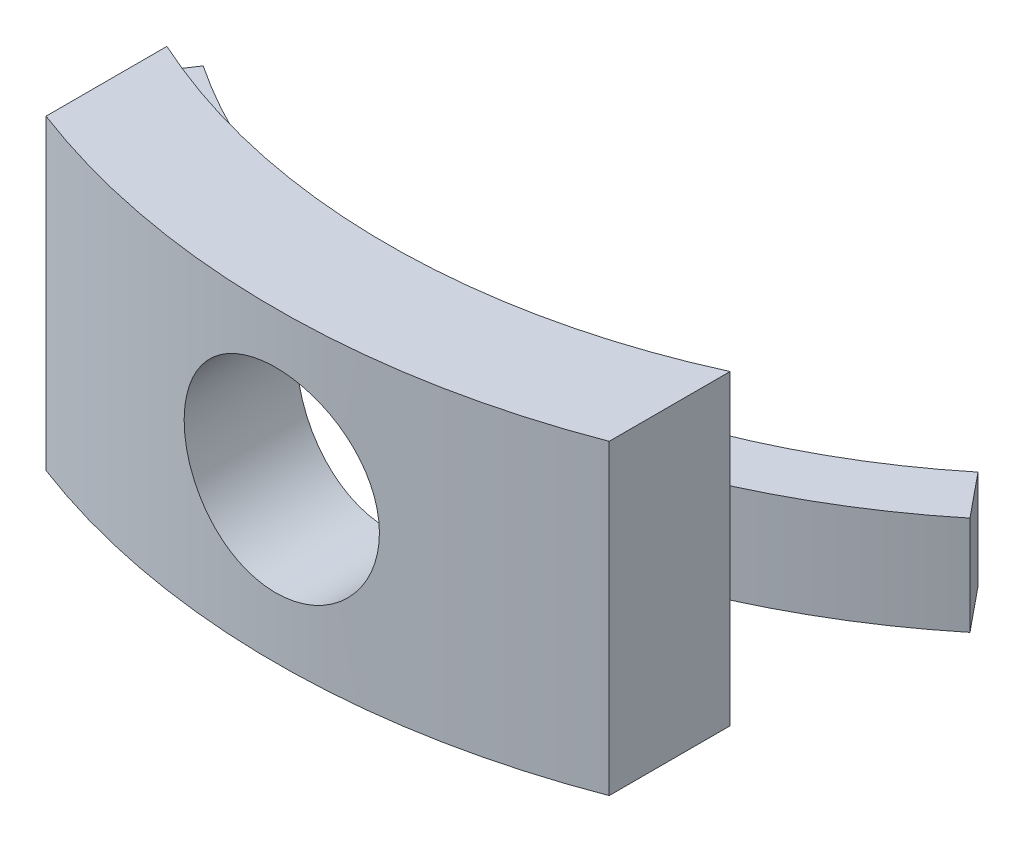
ISO-10303-21;
HEADER;
FILE_DESCRIPTION(('STEP AP214'),'2;1');
FILE_NAME('part.step','',(''),(''),'','','');
FILE_SCHEMA(('AUTOMOTIVE_DESIGN { 1 0 10303 214 1 1 1 1 }'));
ENDSEC;
DATA;
#1=APPLICATION_CONTEXT('core data for automotive mechanical design processes');
#2=APPLICATION_PROTOCOL_DEFINITION('international standard','automotive_design',2000,#1);
#3=PRODUCT_CONTEXT('',#1,'mechanical');
#4=PRODUCT('Part','Part','',(#3));
#5=PRODUCT_RELATED_PRODUCT_CATEGORY('part','',(#4));
#6=PRODUCT_DEFINITION_FORMATION('','',#4);
#7=PRODUCT_DEFINITION_CONTEXT('part definition',#1,'design');
#8=PRODUCT_DEFINITION('design','',#6,#7);
#9=PRODUCT_DEFINITION_SHAPE('','',#8);
#10=(LENGTH_UNIT() NAMED_UNIT(*) SI_UNIT(.MILLI.,.METRE.));
#11=(NAMED_UNIT(*) PLANE_ANGLE_UNIT() SI_UNIT($,.RADIAN.));
#12=(NAMED_UNIT(*) SI_UNIT($,.STERADIAN.) SOLID_ANGLE_UNIT());
#13=UNCERTAINTY_MEASURE_WITH_UNIT(LENGTH_MEASURE(1.E-05),#10,'distance_accuracy_value','');
#14=(GEOMETRIC_REPRESENTATION_CONTEXT(3) GLOBAL_UNCERTAINTY_ASSIGNED_CONTEXT((#13)) GLOBAL_UNIT_ASSIGNED_CONTEXT((#10,
#11,#12)) REPRESENTATION_CONTEXT('',''));
#15=CARTESIAN_POINT('',(0.,0.,0.));
#16=DIRECTION('',(0.,0.,1.));
#17=DIRECTION('',(1.,0.,0.));
#18=AXIS2_PLACEMENT_3D('',#15,#16,#17);
#19=CARTESIAN_POINT('',(0.,31.,0.));
#20=DIRECTION('',(0.,-1.,0.));
#21=DIRECTION('',(0.,0.,-1.));
#22=AXIS2_PLACEMENT_3D('',#19,#20,#21);
#23=CYLINDRICAL_SURFACE('',#22,79.871147441617);
#24=DIRECTION('',(0.,-1.,0.));
#25=VECTOR('',#24,1.);
#26=CARTESIAN_POINT('',(28.4483592669794,31.,74.6330426061901));
#27=LINE('',#26,#25);
#28=CARTESIAN_POINT('',(28.4483592669794,31.,74.6330426061901));
#29=VERTEX_POINT('',#28);
#30=CARTESIAN_POINT('',(28.4483592669794,0.,74.6330426061901));
#31=VERTEX_POINT('',#30);
#32=EDGE_CURVE('E210',#29,#31,#27,.T.);
#33=ORIENTED_EDGE('',*,*,#32,.F.);
#34=CARTESIAN_POINT('',(0.,31.,0.));
#35=DIRECTION('',(0.,1.,0.));
#36=DIRECTION('',(0.,0.,1.));
#37=AXIS2_PLACEMENT_3D('',#34,#35,#36);
#38=CIRCLE('',#37,79.871147441617);
#39=CARTESIAN_POINT('',(-28.4483592669794,31.,74.6330426061901));
#40=VERTEX_POINT('',#39);
#41=EDGE_CURVE('E219',#40,#29,#38,.T.);
#42=ORIENTED_EDGE('',*,*,#41,.F.);
#43=DIRECTION('',(0.,-1.,0.));
#44=VECTOR('',#43,1.);
#45=CARTESIAN_POINT('',(-28.4483592669794,31.,74.6330426061901));
#46=LINE('',#45,#44);
#47=CARTESIAN_POINT('',(-28.4483592669794,0.,74.6330426061901));
#48=VERTEX_POINT('',#47);
#49=EDGE_CURVE('E204',#48,#40,#46,.F.);
#50=ORIENTED_EDGE('',*,*,#49,.F.);
#51=CARTESIAN_POINT('',(0.,0.,0.));
#52=DIRECTION('',(0.,1.,0.));
#53=DIRECTION('',(0.,0.,1.));
#54=AXIS2_PLACEMENT_3D('',#51,#52,#53);
#55=CIRCLE('',#54,79.871147441617);
#56=EDGE_CURVE('E216',#48,#31,#55,.T.);
#57=ORIENTED_EDGE('',*,*,#56,.T.);
#58=EDGE_LOOP('',(#33,#42,#50,#57));
#59=FACE_BOUND('',#58,.T.);
#60=CARTESIAN_POINT('',(-9.86264382995,16.,79.2598791970065));
#61=CARTESIAN_POINT('',(-9.86264696658276,15.724043965762,79.2598781283402));
#62=CARTESIAN_POINT('',(-9.85105782809034,15.4481340800834,79.2613232909355));
#63=CARTESIAN_POINT('',(-9.80479016302804,14.8981993855173,79.2670603327284));
#64=CARTESIAN_POINT('',(-9.77010638127928,14.6241750200213,79.271352859842));
#65=CARTESIAN_POINT('',(-9.67785637083305,14.0798094849791,79.2826679637708));
#66=CARTESIAN_POINT('',(-9.62026905304348,13.809471948131,79.2896930565432));
#67=CARTESIAN_POINT('',(-9.48263887339784,13.2746474573457,79.3062705848251));
#68=CARTESIAN_POINT('',(-9.40259555536711,13.0101606223782,79.3158230716764));
#69=CARTESIAN_POINT('',(-9.22070479047061,12.4890965332151,79.3371739337578));
#70=CARTESIAN_POINT('',(-9.11887259424915,12.2325138896181,79.3489707374909));
#71=CARTESIAN_POINT('',(-8.89410751972114,11.728859319721,79.3744784500112));
#72=CARTESIAN_POINT('',(-8.77117436193213,11.4817875194453,79.3881893841505));
#73=CARTESIAN_POINT('',(-8.50511315639181,10.9989234917408,79.4171337766083));
#74=CARTESIAN_POINT('',(-8.36198891923053,10.763129147176,79.4323669474827));
#75=CARTESIAN_POINT('',(-8.05653931614168,10.3044006905002,79.4639284944082));
#76=CARTESIAN_POINT('',(-7.89421384104697,10.0814666515162,79.4802568766859));
#77=CARTESIAN_POINT('',(-7.55066048824696,9.64894362342099,79.5136317861003));
#78=CARTESIAN_POINT('',(-7.36934422067372,9.43942507779344,79.5306814293151));
#79=CARTESIAN_POINT('',(-6.98973969323522,9.03638613251833,79.5649422808177));
#80=CARTESIAN_POINT('',(-6.7914513674713,8.84286579499392,79.5821534897327));
#81=CARTESIAN_POINT('',(-6.37927309412043,8.47316367851468,79.616253512196));
#82=CARTESIAN_POINT('',(-6.16538220452301,8.29698294795604,79.6331423062007));
#83=CARTESIAN_POINT('',(-5.72350369287743,7.9632151033397,79.6661206132726));
#84=CARTESIAN_POINT('',(-5.49551639049456,7.80562756787839,79.6822101444499));
#85=CARTESIAN_POINT('',(-5.02626847747805,7.50967833063655,79.7131875879296));
#86=CARTESIAN_POINT('',(-4.78496718105647,7.37138070117975,79.7280714299371));
#87=CARTESIAN_POINT('',(-4.2914705145732,7.11561692849111,79.7561567975579));
#88=CARTESIAN_POINT('',(-4.03927511338672,6.99815084478053,79.7693583183643));
#89=CARTESIAN_POINT('',(-3.52578555569627,6.78491114854234,79.7937032958442));
#90=CARTESIAN_POINT('',(-3.26449165664854,6.68913692278425,79.804846810696));
#91=CARTESIAN_POINT('',(-2.73466423829995,6.51998492280477,79.8247585359014));
#92=CARTESIAN_POINT('',(-2.46613075855558,6.44660702623862,79.8335267592304));
#93=CARTESIAN_POINT('',(-1.92514076999934,6.32311191377801,79.8483993028123));
#94=CARTESIAN_POINT('',(-1.65271133241111,6.27287770941379,79.8545170115067));
#95=CARTESIAN_POINT('',(-1.10454552517972,6.1954938923426,79.863980067521));
#96=CARTESIAN_POINT('',(-0.828809165646685,6.16834420907843,79.8673254233145));
#97=CARTESIAN_POINT('',(-0.27601953108325,6.13733359347682,79.8711487402851));
#98=CARTESIAN_POINT('',(0.00103369878883756,6.13347186822982,79.8716267990879));
#99=CARTESIAN_POINT('',(0.554472749260557,6.14906415051791,79.8697021898379));
#100=CARTESIAN_POINT('',(0.830858571801191,6.16851809016266,79.8672995301731));
#101=CARTESIAN_POINT('',(1.37947438590318,6.23042572020437,79.8597025858633));
#102=CARTESIAN_POINT('',(1.65171882242678,6.27275338182472,79.8545235993588));
#103=CARTESIAN_POINT('',(2.1916522912527,6.38001240373682,79.8415291791762));
#104=CARTESIAN_POINT('',(2.45934134280565,6.44494366848303,79.8337137566424));
#105=CARTESIAN_POINT('',(2.98828087022174,6.59693444431373,79.8156651548402));
#106=CARTESIAN_POINT('',(3.24953126301698,6.68399424072415,79.8054319443968));
#107=CARTESIAN_POINT('',(3.76376096398634,6.87960954405895,79.7828336226585));
#108=CARTESIAN_POINT('',(4.01674023933491,6.98816513628155,79.7704685029039));
#109=CARTESIAN_POINT('',(4.5133186726662,7.2263051064905,79.7439160208358));
#110=CARTESIAN_POINT('',(4.75689146495211,7.35594393645696,79.7297239603878));
#111=CARTESIAN_POINT('',(5.23226050904725,7.63512264295052,79.6999395825138));
#112=CARTESIAN_POINT('',(5.46405674783361,7.78466254148418,79.6843472635394));
#113=CARTESIAN_POINT('',(5.91427638232241,8.10259379255056,79.6521969121733));
#114=CARTESIAN_POINT('',(6.13269941514929,8.27098565627202,79.6356388536004));
#115=CARTESIAN_POINT('',(6.55466451387141,8.62544622892559,79.6020186621458));
#116=CARTESIAN_POINT('',(6.75820619296452,8.81151539704448,79.5849565161779));
#117=CARTESIAN_POINT('',(7.15030197341924,9.2013341707989,79.550690580871));
#118=CARTESIAN_POINT('',(7.33874711981968,9.40519336896074,79.5334866055192));
#119=CARTESIAN_POINT('',(7.69780575756292,9.82809010596968,79.4995378017679));
#120=CARTESIAN_POINT('',(7.86841916468626,10.0471277164964,79.4827929755373));
#121=CARTESIAN_POINT('',(8.19061080839482,10.498854229147,79.4502379876541));
#122=CARTESIAN_POINT('',(8.34218870857845,10.7315433724185,79.4344278425223));
#123=CARTESIAN_POINT('',(8.62522023672006,11.2089334306861,79.4041940611519));
#124=CARTESIAN_POINT('',(8.75667438405841,11.4536340354592,79.389770389133));
#125=CARTESIAN_POINT('',(8.99856588286977,11.9534376893229,79.3627168910243));
#126=CARTESIAN_POINT('',(9.10899421934409,12.2085451437743,79.3500878349776));
#127=CARTESIAN_POINT('',(9.30795642986299,12.7272562427612,79.3269952720307));
#128=CARTESIAN_POINT('',(9.39649028120762,12.9908598961051,79.3165317673757));
#129=CARTESIAN_POINT('',(9.55100476849951,13.5246707031799,79.2980741377814));
#130=CARTESIAN_POINT('',(9.61698627189467,13.7948776024968,79.2900799178655));
#131=CARTESIAN_POINT('',(9.72590660595764,14.3399615493953,79.2767932608667));
#132=CARTESIAN_POINT('',(9.768845570589,14.6148385698164,79.2715008080766));
#133=CARTESIAN_POINT('',(9.83115146708022,15.165455879784,79.2637977557151));
#134=CARTESIAN_POINT('',(9.85067179810819,15.4411785577722,79.2613684038339));
#135=CARTESIAN_POINT('',(9.86650746011319,15.993299236674,79.2593987425033));
#136=CARTESIAN_POINT('',(9.86282289236764,16.2696972346349,79.2598584204447));
#137=CARTESIAN_POINT('',(9.83227680311717,16.8211837170445,79.2636534734639));
#138=CARTESIAN_POINT('',(9.80541574209264,17.0962722274016,79.2669887914073));
#139=CARTESIAN_POINT('',(9.72871803660886,17.6431785901157,79.2764386727422));
#140=CARTESIAN_POINT('',(9.6788814045958,17.9149964442445,79.2825532346282));
#141=CARTESIAN_POINT('',(9.55680461139089,18.4525380525602,79.2973608722259));
#142=CARTESIAN_POINT('',(9.48463878675121,18.7182789311008,79.3060453881312));
#143=CARTESIAN_POINT('',(9.31837890674631,19.2427192138261,79.3257524967247));
#144=CARTESIAN_POINT('',(9.22428491589871,19.5014186387258,79.3367750825337));
#145=CARTESIAN_POINT('',(9.0148645478259,20.0099327781155,79.3608436828133));
#146=CARTESIAN_POINT('',(8.89954126830556,20.2597487825064,79.3738894020316));
#147=CARTESIAN_POINT('',(8.64843338106484,20.7488892377862,79.4016419630735));
#148=CARTESIAN_POINT('',(8.51264162399948,20.9882099849785,79.4163493848546));
#149=CARTESIAN_POINT('',(8.22085948147554,21.455779477421,79.4470847834542));
#150=CARTESIAN_POINT('',(8.06477184694111,21.6839671291475,79.4631189736059));
#151=CARTESIAN_POINT('',(7.73402947135313,22.1264033210491,79.4959910247821));
#152=CARTESIAN_POINT('',(7.55937463497976,22.3406517896544,79.5128288899323));
#153=CARTESIAN_POINT('',(7.19268138974248,22.753767491566,79.5468379580691));
#154=CARTESIAN_POINT('',(7.00063940735372,22.952631547317,79.5640092290073));
#155=CARTESIAN_POINT('',(6.60060691091961,23.3334831051751,79.5981938003825));
#156=CARTESIAN_POINT('',(6.39262190683746,23.5154763902653,79.6152071531379));
#157=CARTESIAN_POINT('',(5.96084839123625,23.8623891105437,79.6487013370117));
#158=CARTESIAN_POINT('',(5.73697600191148,24.0272045194798,79.665178549915));
#159=CARTESIAN_POINT('',(5.27606542440311,24.3373881063109,79.6970305622354));
#160=CARTESIAN_POINT('',(5.03902717990492,24.4827562010143,79.7124053569366));
#161=CARTESIAN_POINT('',(4.55345551043582,24.7529987607344,79.7416163875724));
#162=CARTESIAN_POINT('',(4.30492224428381,24.8778735087855,79.755452644755));
#163=CARTESIAN_POINT('',(3.79811546354315,25.1062237210269,79.7811937863016));
#164=CARTESIAN_POINT('',(3.53984198896272,25.2096992731039,79.7930986785978));
#165=CARTESIAN_POINT('',(3.01608359993133,25.3942469070819,79.8146098280658));
#166=CARTESIAN_POINT('',(2.75061946649594,25.4753772670064,79.8242220557324));
#167=CARTESIAN_POINT('',(2.21372302258265,25.6149940472697,79.8409152730324));
#168=CARTESIAN_POINT('',(1.94229071879767,25.6734804930008,79.8479962655044));
#169=CARTESIAN_POINT('',(1.39541578187981,25.7673705321292,79.8594252586524));
#170=CARTESIAN_POINT('',(1.11997329690639,25.8027749761087,79.8637733600364));
#171=CARTESIAN_POINT('',(0.567054494373511,25.8502377826838,79.8696129804327));
#172=CARTESIAN_POINT('',(0.289578186590195,25.8622962574244,79.8711045131667));
#173=CARTESIAN_POINT('',(-0.263554421094104,25.8629743218898,79.8711882608607));
#174=CARTESIAN_POINT('',(-0.539210540252787,25.851749409795,79.8697997104687));
#175=CARTESIAN_POINT('',(-1.08858483534829,25.8062580040041,79.8642012310253));
#176=CARTESIAN_POINT('',(-1.36230302048912,25.7719916198153,79.8599913153828));
#177=CARTESIAN_POINT('',(-1.90585394458154,25.6806720362887,79.8488685660483));
#178=CARTESIAN_POINT('',(-2.17568669601114,25.6236189101471,79.8419557410389));
#179=CARTESIAN_POINT('',(-2.70955758952037,25.4871466824838,79.8256213146454));
#180=CARTESIAN_POINT('',(-2.97359572063672,25.40772753865,79.8161997085152));
#181=CARTESIAN_POINT('',(-3.49392993295445,25.2271345535241,79.7951153242388));
#182=CARTESIAN_POINT('',(-3.75022861953121,25.1259681283953,79.7834533102504));
#183=CARTESIAN_POINT('',(-4.25338770313224,24.9025952926152,79.7582117817309));
#184=CARTESIAN_POINT('',(-4.50024810803439,24.7803888995257,79.7446322688002));
#185=CARTESIAN_POINT('',(-4.98276542848284,24.5158369181377,79.7159372427778));
#186=CARTESIAN_POINT('',(-5.2184247914415,24.3734957565358,79.7008220675118));
#187=CARTESIAN_POINT('',(-5.67707571832653,24.0695891706744,79.6694663906105));
#188=CARTESIAN_POINT('',(-5.90006153987121,23.9080151329927,79.6532253861441));
#189=CARTESIAN_POINT('',(-6.33309671426584,23.5657308734298,79.6199695203625));
#190=CARTESIAN_POINT('',(-6.54305437462838,23.3849050515046,79.6029503800023));
#191=CARTESIAN_POINT('',(-6.94692258388897,23.0063247408928,79.5687220250458));
#192=CARTESIAN_POINT('',(-7.14083988556123,22.8085774479853,79.5515128939273));
#193=CARTESIAN_POINT('',(-7.51145941652562,22.3973719099105,79.5173743837564));
#194=CARTESIAN_POINT('',(-7.68815373703867,22.1839065252521,79.5004451361617));
#195=CARTESIAN_POINT('',(-8.02298349069275,21.7428340302054,79.4673533060841));
#196=CARTESIAN_POINT('',(-8.18111916668683,21.5152271049289,79.4511907135707));
#197=CARTESIAN_POINT('',(-8.47827777237264,21.0465657343905,79.420031565964));
#198=CARTESIAN_POINT('',(-8.61722588762101,20.8054635314269,79.4050396690166));
#199=CARTESIAN_POINT('',(-8.87429139723532,20.3123101189386,79.3767212408909));
#200=CARTESIAN_POINT('',(-8.99240907512245,20.060259058496,79.3633946870464));
#201=CARTESIAN_POINT('',(-9.20685081629181,19.5472315109248,79.3388035143284));
#202=CARTESIAN_POINT('',(-9.30319577561485,19.2862638607248,79.3275369204397));
#203=CARTESIAN_POINT('',(-9.47350243860879,18.7571273585486,79.3073784631205));
#204=CARTESIAN_POINT('',(-9.54746943991249,18.4889602273293,79.2984860377013));
#205=CARTESIAN_POINT('',(-9.69381047042143,17.8548916547359,79.2807510962083));
#206=CARTESIAN_POINT('',(-9.75705805481611,17.4868165831453,79.2729575377792));
#207=CARTESIAN_POINT('',(-9.84147246125529,16.7457995675794,79.2625223290322));
#208=CARTESIAN_POINT('',(-9.86263959189245,16.3728576593148,79.2598806409336));
#209=CARTESIAN_POINT('',(-9.86264382995,16.,79.2598791970065));
#210=B_SPLINE_CURVE_WITH_KNOTS('',3,(#60,#61,#62,#63,#64,#65,#66,#67,#68,#69,#70,#71,#72,#73,
#74,#75,#76,#77,#78,#79,#80,#81,#82,#83,#84,#85,#86,#87,#88,#89,#90,#91,#92,#93,#94,#95,#96,#97,
#98,#99,#100,#101,#102,#103,#104,#105,#106,#107,#108,#109,#110,#111,#112,#113,#114,#115,#116,
#117,#118,#119,#120,#121,#122,#123,#124,#125,#126,#127,#128,#129,#130,#131,#132,#133,#134,#135,
#136,#137,#138,#139,#140,#141,#142,#143,#144,#145,#146,#147,#148,#149,#150,#151,#152,#153,#154,
#155,#156,#157,#158,#159,#160,#161,#162,#163,#164,#165,#166,#167,#168,#169,#170,#171,#172,#173,
#174,#175,#176,#177,#178,#179,#180,#181,#182,#183,#184,#185,#186,#187,#188,#189,#190,#191,#192,
#193,#194,#195,#196,#197,#198,#199,#200,#201,#202,#203,#204,#205,#206,#207,#208,#209),
.UNSPECIFIED.,.T.,.F.,(4,2,2,2,2,2,2,2,2,2,2,2,2,2,2,2,2,2,2,2,2,2,2,2,2,2,2,2,2,2,2,2,2,2,2,2,
2,2,2,2,2,2,2,2,2,2,2,2,2,2,2,2,2,2,2,2,2,2,2,2,2,2,2,2,2,2,2,2,2,2,2,2,2,2,4),(0.,
0.827541773535359,1.65527191832451,2.48376599062757,3.31227689430653,4.14020978601186,
4.9681536445438,5.79594145671658,6.62373397543937,7.45556668697894,8.2874026284829,
9.11928883401908,9.9511561817304,10.7857239698547,11.620294142523,12.4548407188833,
13.2893827362723,14.1196586704703,14.9499320669432,15.7801771940662,16.610419903695,
17.4361341313341,18.2618448687177,19.0875662533792,19.9132909146797,20.7411830803457,
21.5690761615005,22.3969916971932,23.224928744755,24.0583849741057,24.8918451396989,
25.7253200323951,26.5587734100437,27.3925833372972,28.2263941290321,29.0601728456667,
29.8939467148687,30.7222287602759,31.5505071906615,32.3787691648395,33.2070306903374,
34.0325639741872,34.858094829162,35.6835053208557,36.5092047875126,37.3390174465945,
38.1688343659523,38.998822223788,39.8285245171376,40.6629904321853,41.4974599167864,
42.3319178755311,43.166372407087,43.9986295507143,44.8308857610648,45.6631113006572,
46.4953328425452,47.3220142891312,48.1486918068437,48.9753666690972,49.8020430952634,
50.6284380577811,51.454832330515,52.2810451992604,53.1076294886016,53.939491644243,
54.7710017956745,55.602891994651,56.4347713065384,57.2698077682066,58.1048328633922,
58.9390531197369,59.7730757326256,60.8912159910939,62.0093480497661),.UNSPECIFIED.);
#211=CARTESIAN_POINT('',(-9.86264382995,16.,79.2598791970065));
#212=VERTEX_POINT('',#211);
#213=EDGE_CURVE('E152',#212,#212,#210,.T.);
#214=ORIENTED_EDGE('',*,*,#213,.F.);
#215=EDGE_LOOP('',(#214));
#216=FACE_BOUND('',#215,.T.);
#217=ADVANCED_FACE('F33',(#59,#216),#23,.T.);
#218=CARTESIAN_POINT('',(0.,31.,0.));
#219=DIRECTION('',(0.,-1.,0.));
#220=DIRECTION('',(0.,0.,-1.));
#221=AXIS2_PLACEMENT_3D('',#218,#219,#220);
#222=CYLINDRICAL_SURFACE('',#221,68.5950864529741);
#223=CARTESIAN_POINT('',(0.,11.,0.));
#224=DIRECTION('',(0.,1.,0.));
#225=DIRECTION('',(0.,0.,1.));
#226=AXIS2_PLACEMENT_3D('',#223,#224,#225);
#227=CIRCLE('',#226,68.5950864529741);
#228=CARTESIAN_POINT('',(-28.4483592669794,11.,62.4177598164806));
#229=VERTEX_POINT('',#228);
#230=CARTESIAN_POINT('',(-20.3657342076217,11.,65.5020820713013));
#231=VERTEX_POINT('',#230);
#232=EDGE_CURVE('E183',#229,#231,#227,.T.);
#233=ORIENTED_EDGE('',*,*,#232,.T.);
#234=DIRECTION('',(0.,1.,0.));
#235=VECTOR('',#234,1.);
#236=CARTESIAN_POINT('',(-20.3657342076217,3.00000000000001,65.5020820713013));
#237=LINE('',#236,#235);
#238=CARTESIAN_POINT('',(-20.3657342076217,21.,65.5020820713013));
#239=VERTEX_POINT('',#238);
#240=EDGE_CURVE('E54',#231,#239,#237,.T.);
#241=ORIENTED_EDGE('',*,*,#240,.T.);
#242=CARTESIAN_POINT('',(0.,21.,0.));
#243=DIRECTION('',(0.,1.,0.));
#244=DIRECTION('',(0.,0.,1.));
#245=AXIS2_PLACEMENT_3D('',#242,#243,#244);
#246=CIRCLE('',#245,68.5950864529741);
#247=CARTESIAN_POINT('',(-28.4483592669794,21.,62.4177598164806));
#248=VERTEX_POINT('',#247);
#249=EDGE_CURVE('E61',#248,#239,#246,.T.);
#250=ORIENTED_EDGE('',*,*,#249,.F.);
#251=DIRECTION('',(0.,-1.,0.));
#252=VECTOR('',#251,1.);
#253=CARTESIAN_POINT('',(-28.4483592669794,31.,62.4177598164806));
#254=LINE('',#253,#252);
#255=CARTESIAN_POINT('',(-28.4483592669794,31.,62.4177598164806));
#256=VERTEX_POINT('',#255);
#257=EDGE_CURVE('E222',#248,#256,#254,.F.);
#258=ORIENTED_EDGE('',*,*,#257,.T.);
#259=CARTESIAN_POINT('',(0.,31.,0.));
#260=DIRECTION('',(0.,1.,0.));
#261=DIRECTION('',(0.,0.,1.));
#262=AXIS2_PLACEMENT_3D('',#259,#260,#261);
#263=CIRCLE('',#262,68.5950864529741);
#264=CARTESIAN_POINT('',(28.4483592669794,31.,62.4177598164806));
#265=VERTEX_POINT('',#264);
#266=EDGE_CURVE('E213',#256,#265,#263,.T.);
#267=ORIENTED_EDGE('',*,*,#266,.T.);
#268=DIRECTION('',(0.,-1.,0.));
#269=VECTOR('',#268,1.);
#270=CARTESIAN_POINT('',(28.4483592669794,31.,62.4177598164806));
#271=LINE('',#270,#269);
#272=CARTESIAN_POINT('',(28.4483592669794,21.,62.4177598164806));
#273=VERTEX_POINT('',#272);
#274=EDGE_CURVE('E229',#265,#273,#271,.T.);
#275=ORIENTED_EDGE('',*,*,#274,.T.);
#276=CARTESIAN_POINT('',(20.3657342076217,21.,65.5020820713013));
#277=VERTEX_POINT('',#276);
#278=EDGE_CURVE('E172',#277,#273,#246,.T.);
#279=ORIENTED_EDGE('',*,*,#278,.F.);
#280=DIRECTION('',(0.,1.,0.));
#281=VECTOR('',#280,1.);
#282=CARTESIAN_POINT('',(20.3657342076217,3.00000000000001,65.5020820713013));
#283=LINE('',#282,#281);
#284=CARTESIAN_POINT('',(20.3657342076217,11.,65.5020820713013));
#285=VERTEX_POINT('',#284);
#286=EDGE_CURVE('E285',#285,#277,#283,.T.);
#287=ORIENTED_EDGE('',*,*,#286,.F.);
#288=CARTESIAN_POINT('',(28.4483592669794,11.,62.4177598164806));
#289=VERTEX_POINT('',#288);
#290=EDGE_CURVE('E184',#285,#289,#227,.T.);
#291=ORIENTED_EDGE('',*,*,#290,.T.);
#292=CARTESIAN_POINT('',(28.4483592669794,0.,62.4177598164806));
#293=VERTEX_POINT('',#292);
#294=EDGE_CURVE('E228',#289,#293,#271,.T.);
#295=ORIENTED_EDGE('',*,*,#294,.T.);
#296=CARTESIAN_POINT('',(0.,0.,0.));
#297=DIRECTION('',(0.,1.,0.));
#298=DIRECTION('',(0.,0.,1.));
#299=AXIS2_PLACEMENT_3D('',#296,#297,#298);
#300=CIRCLE('',#299,68.5950864529741);
#301=CARTESIAN_POINT('',(-28.4483592669794,0.,62.4177598164806));
#302=VERTEX_POINT('',#301);
#303=EDGE_CURVE('E212',#302,#293,#300,.T.);
#304=ORIENTED_EDGE('',*,*,#303,.F.);
#305=EDGE_CURVE('E225',#302,#229,#254,.F.);
#306=ORIENTED_EDGE('',*,*,#305,.T.);
#307=EDGE_LOOP('',(#233,#241,#250,#258,#267,#275,#279,#287,#291,#295,#304,#306));
#308=FACE_BOUND('',#307,.T.);
#309=CARTESIAN_POINT('',(-9.86264382995,16.,67.8823551607819));
#310=CARTESIAN_POINT('',(-9.86264742723204,15.7244500956227,67.8823537380072));
#311=CARTESIAN_POINT('',(-9.85109213641481,15.4489511864537,67.8840362795132));
#312=CARTESIAN_POINT('',(-9.80496259106462,14.8998414352881,67.8907148877594));
#313=CARTESIAN_POINT('',(-9.77038339024,14.6262310117644,67.8957116665056));
#314=CARTESIAN_POINT('',(-9.67841866297132,14.0827095781849,67.9088819253091));
#315=CARTESIAN_POINT('',(-9.62101321511549,13.8128020131939,67.917058180089));
#316=CARTESIAN_POINT('',(-9.48382804772368,13.2788363877153,67.9363502508547));
#317=CARTESIAN_POINT('',(-9.40404796235984,13.0147784229455,67.9474661149034));
#318=CARTESIAN_POINT('',(-9.22277536827444,12.4945801667935,67.9723079968537));
#319=CARTESIAN_POINT('',(-9.12129957127844,12.2384339539887,67.9860320048609));
#320=CARTESIAN_POINT('',(-8.89733821246156,11.7356289864401,68.0157041398814));
#321=CARTESIAN_POINT('',(-8.77485239143795,11.4889703487915,68.0316522943337));
#322=CARTESIAN_POINT('',(-8.50979347977899,11.0069257807733,68.0653151925315));
#323=CARTESIAN_POINT('',(-8.36722692133326,10.7715362178473,68.0830293612538));
#324=CARTESIAN_POINT('',(-8.06293271623876,10.3134819883811,68.1197363825075));
#325=CARTESIAN_POINT('',(-7.90119881278223,10.0908215123588,68.1387296516981));
#326=CARTESIAN_POINT('',(-7.55863407023297,9.65844203596765,68.1775830561895));
#327=CARTESIAN_POINT('',(-7.37768719311063,9.44881539164578,68.197447977662));
#328=CARTESIAN_POINT('',(-6.99882370329791,9.04552254715729,68.2373697061662));
#329=CARTESIAN_POINT('',(-6.80090703127116,8.85185640280258,68.2574265138687));
#330=CARTESIAN_POINT('',(-6.38942724615898,8.48178566759484,68.2971729100288));
#331=CARTESIAN_POINT('',(-6.17586056270827,8.30538503723859,68.3168624133968));
#332=CARTESIAN_POINT('',(-5.73467437466727,7.97118878458166,68.3553099534987));
#333=CARTESIAN_POINT('',(-5.50705981311402,7.81338667423531,68.3740683137296));
#334=CARTESIAN_POINT('',(-5.0382093933644,7.5167521315879,68.4102174810375));
#335=CARTESIAN_POINT('',(-4.79691576718103,7.37801016843828,68.4276016102816));
#336=CARTESIAN_POINT('',(-4.30336066205989,7.12136292344203,68.4604128792113));
#337=CARTESIAN_POINT('',(-4.05109914050458,7.00345772256903,68.4758400112918));
#338=CARTESIAN_POINT('',(-3.53740451348405,6.78935727920546,68.5042977982596));
#339=CARTESIAN_POINT('',(-3.27597175494302,6.6931612165353,68.51732854368));
#340=CARTESIAN_POINT('',(-2.74579527377369,6.52319443212313,68.5406222064174));
#341=CARTESIAN_POINT('',(-2.47705160553696,6.4494235435924,68.55088514432));
#342=CARTESIAN_POINT('',(-1.93606652624477,6.32529712659026,68.5682890578159));
#343=CARTESIAN_POINT('',(-1.66386207390222,6.27478345300272,68.5754510984881));
#344=CARTESIAN_POINT('',(-1.11610599942557,6.19680773375573,68.5865528219683));
#345=CARTESIAN_POINT('',(-0.840554391127326,6.16934559284302,68.5904925180917));
#346=CARTESIAN_POINT('',(-0.288102999929997,6.13768343374726,68.5950376024713));
#347=CARTESIAN_POINT('',(-0.0112032786484162,6.13348236218966,68.5956431417144));
#348=CARTESIAN_POINT('',(0.541955575741564,6.14837180041126,68.5935030906428));
#349=CARTESIAN_POINT('',(0.818214711384981,6.16746221785986,68.5907575136125));
#350=CARTESIAN_POINT('',(1.36606490833253,6.22856114560699,68.5820257509721));
#351=CARTESIAN_POINT('',(1.63767537960649,6.27039924894854,68.5760636633563));
#352=CARTESIAN_POINT('',(2.17637676450133,6.3765653429344,68.5610813711164));
#353=CARTESIAN_POINT('',(2.44346770401661,6.4408932046791,68.5520611840197));
#354=CARTESIAN_POINT('',(2.97125739213998,6.59156279513293,68.5312138502918));
#355=CARTESIAN_POINT('',(3.23195603595291,6.67790488447866,68.5193866576766));
#356=CARTESIAN_POINT('',(3.7451410115711,6.87197072419959,68.4932538495177));
#357=CARTESIAN_POINT('',(3.99762729988346,6.9796945877919,68.4789482208505));
#358=CARTESIAN_POINT('',(4.4934615976489,7.21613782644175,68.4482037688905));
#359=CARTESIAN_POINT('',(4.73677666279887,7.3449253856719,68.4317580545972));
#360=CARTESIAN_POINT('',(5.21179660601485,7.62237479333538,68.3972207177973));
#361=CARTESIAN_POINT('',(5.44349711076403,7.77104405182922,68.3791284824269));
#362=CARTESIAN_POINT('',(5.89352315473021,8.08711761496669,68.3418118067908));
#363=CARTESIAN_POINT('',(6.11185347278476,8.25451516445891,68.3225877759328));
#364=CARTESIAN_POINT('',(6.53383669641045,8.60700758626014,68.2835250526275));
#365=CARTESIAN_POINT('',(6.73748287081552,8.79211048532826,68.2636860841782));
#366=CARTESIAN_POINT('',(7.13036949775295,9.18042894202512,68.2237720062779));
#367=CARTESIAN_POINT('',(7.31946290391429,9.3837932551169,68.2036963845812));
#368=CARTESIAN_POINT('',(7.67977584087033,9.80567161329438,68.1640651246553));
#369=CARTESIAN_POINT('',(7.85100333658808,10.0241788344861,68.1445092576339));
#370=CARTESIAN_POINT('',(8.17454442360551,10.4750041395447,68.1064553672225));
#371=CARTESIAN_POINT('',(8.32684993524324,10.707328060941,68.0879577975303));
#372=CARTESIAN_POINT('',(8.61131936790562,11.1839928000639,68.0525650552322));
#373=CARTESIAN_POINT('',(8.74349095024658,11.4283289998566,68.0356692740461));
#374=CARTESIAN_POINT('',(8.98691049773859,11.927607267354,68.0039440982567));
#375=CARTESIAN_POINT('',(9.09814005075804,12.1825584294571,67.9891165249522));
#376=CARTESIAN_POINT('',(9.29871054565807,12.7010617746814,67.9619755269281));
#377=CARTESIAN_POINT('',(9.38805145503879,12.9646139705724,67.9496621059414));
#378=CARTESIAN_POINT('',(9.54416946239884,13.4984207595887,67.9279098222343));
#379=CARTESIAN_POINT('',(9.61094775150848,13.7686749980897,67.9184708077702));
#380=CARTESIAN_POINT('',(9.72143782318303,14.3139481682003,67.9027440666289));
#381=CARTESIAN_POINT('',(9.7651497897672,14.5889670617802,67.8964563148115));
#382=CARTESIAN_POINT('',(9.82888580672931,15.1393048641911,67.8872588761962));
#383=CARTESIAN_POINT('',(9.8491175705325,15.414599238431,67.8843195722906));
#384=CARTESIAN_POINT('',(9.8664404708294,15.9659297101827,67.8818040119224));
#385=CARTESIAN_POINT('',(9.86353174403369,16.241965803303,67.8822277355915));
#386=CARTESIAN_POINT('',(9.8345964370182,16.7927899305186,67.886425819369));
#387=CARTESIAN_POINT('',(9.80857048229254,17.0675779981802,67.8902000888201));
#388=CARTESIAN_POINT('',(9.73359957057719,17.6139444966956,67.900989358769));
#389=CARTESIAN_POINT('',(9.68465463224641,17.8855229301623,67.9080043566284));
#390=CARTESIAN_POINT('',(9.56449132561134,18.4223018966131,67.9250325747184));
#391=CARTESIAN_POINT('',(9.4933759084184,18.6875259285922,67.9350319277865));
#392=CARTESIAN_POINT('',(9.32932775203875,19.2110162791414,67.9577543740489));
#393=CARTESIAN_POINT('',(9.23639510142655,19.4692826259539,67.9704774561852));
#394=CARTESIAN_POINT('',(9.02940317016535,19.9770310102506,67.9982842350636));
#395=CARTESIAN_POINT('',(8.9153467772094,20.2265142428776,68.0133676091013));
#396=CARTESIAN_POINT('',(8.66687247077856,20.7151041560184,68.0454766763176));
#397=CARTESIAN_POINT('',(8.53244742708764,20.9542071649919,68.0625030491418));
#398=CARTESIAN_POINT('',(8.24323684408427,21.4218900746522,68.0981372256167));
#399=CARTESIAN_POINT('',(8.08831978332282,21.6503878923661,68.1167549436721));
#400=CARTESIAN_POINT('',(7.75992673984183,22.093549071311,68.1549465358248));
#401=CARTESIAN_POINT('',(7.5864506270381,22.3082123355559,68.1745204166235));
#402=CARTESIAN_POINT('',(7.22210603993668,22.722275863674,68.2140795159844));
#403=CARTESIAN_POINT('',(7.0312337898943,22.9216727967031,68.2340648231124));
#404=CARTESIAN_POINT('',(6.6335140236054,23.3037143849429,68.2738771039926));
#405=CARTESIAN_POINT('',(6.42667200244018,23.4863647556172,68.2937041296401));
#406=CARTESIAN_POINT('',(5.99669958840875,23.8350847905877,68.3328064124787));
#407=CARTESIAN_POINT('',(5.77345458100092,24.001013790454,68.3520761497389));
#408=CARTESIAN_POINT('',(5.31367672206621,24.3134734136955,68.3893552506706));
#409=CARTESIAN_POINT('',(5.07714379288714,24.4600039236927,68.4073646069753));
#410=CARTESIAN_POINT('',(4.59245106341801,24.7326081111596,68.4416122886424));
#411=CARTESIAN_POINT('',(4.34429146771133,24.8586821484084,68.4578506451507));
#412=CARTESIAN_POINT('',(3.83809282979317,25.0894531439769,68.4880953670344));
#413=CARTESIAN_POINT('',(3.58005384193455,25.194150219885,68.502101744687));
#414=CARTESIAN_POINT('',(3.05683402304996,25.3810669699728,68.5274398231503));
#415=CARTESIAN_POINT('',(2.79168080432077,25.4633627050868,68.5387805564508));
#416=CARTESIAN_POINT('',(2.25527784130776,25.605333676552,68.5585270407205));
#417=CARTESIAN_POINT('',(1.9840281057166,25.6650089451542,68.5669327958744));
#418=CARTESIAN_POINT('',(1.43739854603711,25.7612828505742,68.5805694841531));
#419=CARTESIAN_POINT('',(1.16201893211291,25.79788265762,68.5858005782743));
#420=CARTESIAN_POINT('',(0.609111935260082,25.8477292879637,68.5929391644959));
#421=CARTESIAN_POINT('',(0.33158456651214,25.8609762653181,68.5948466785216));
#422=CARTESIAN_POINT('',(-0.221093865942146,25.8640020950757,68.5952817563642));
#423=CARTESIAN_POINT('',(-0.496243775679909,25.8539916272483,68.5938396629465));
#424=CARTESIAN_POINT('',(-1.04470629273657,25.8110139957476,68.5876788256991));
#425=CARTESIAN_POINT('',(-1.31801891187537,25.7780469799045,68.5829601029695));
#426=CARTESIAN_POINT('',(-1.86086045294705,25.6894053251555,68.57037841987));
#427=CARTESIAN_POINT('',(-2.1303893968542,25.6337308181834,68.5625154777685));
#428=CARTESIAN_POINT('',(-2.663759090774,25.5000903773954,68.5438654176612));
#429=CARTESIAN_POINT('',(-2.92759982692778,25.4221243892747,68.5330782925316));
#430=CARTESIAN_POINT('',(-3.44753214076561,25.2445482040803,68.5088905870419));
#431=CARTESIAN_POINT('',(-3.70362976192498,25.1449554109182,68.4954921090199));
#432=CARTESIAN_POINT('',(-4.20660672924395,24.9247743028636,68.4664431161836));
#433=CARTESIAN_POINT('',(-4.45348284202478,24.804178706052,68.4507918206185));
#434=CARTESIAN_POINT('',(-4.93618558618662,24.5428988598078,68.4176766770208));
#435=CARTESIAN_POINT('',(-5.17201396788922,24.4022178069608,68.4002131175292));
#436=CARTESIAN_POINT('',(-5.63105466653755,24.1017417587221,68.363953424915));
#437=CARTESIAN_POINT('',(-5.8542668721096,23.9419465946326,68.3451572800319));
#438=CARTESIAN_POINT('',(-6.28845700481377,23.6028671996145,68.3065818329562));
#439=CARTESIAN_POINT('',(-6.49931027319781,23.4234241371855,68.2867953462039));
#440=CARTESIAN_POINT('',(-6.90511219225622,23.0475271667357,68.2469550612776));
#441=CARTESIAN_POINT('',(-7.10006584192028,22.8510786457472,68.2269013494466));
#442=CARTESIAN_POINT('',(-7.47286858449877,22.4423992844563,68.1870756624289));
#443=CARTESIAN_POINT('',(-7.65071078792026,22.2301621477418,68.1673038034296));
#444=CARTESIAN_POINT('',(-7.98795790909295,21.7914440116222,68.128608033096));
#445=CARTESIAN_POINT('',(-8.14736304658436,21.5649631820287,68.1096841116573));
#446=CARTESIAN_POINT('',(-8.44738664999461,21.0981160069749,68.0731262029863));
#447=CARTESIAN_POINT('',(-8.58790379087089,20.8576839624449,68.055499385966));
#448=CARTESIAN_POINT('',(-8.84815438697998,20.3657019930655,68.0221527733714));
#449=CARTESIAN_POINT('',(-8.96788817346435,20.1141522454937,68.0064329474041));
#450=CARTESIAN_POINT('',(-9.18559360263383,19.6019395606185,67.9773699165736));
#451=CARTESIAN_POINT('',(-9.28358528010829,19.3412852714733,67.9640245259957));
#452=CARTESIAN_POINT('',(-9.45719120597848,18.812597239142,67.9400844577972));
#453=CARTESIAN_POINT('',(-9.53281054134174,18.5445651886662,67.9294891549358));
#454=CARTESIAN_POINT('',(-9.68508306316015,17.9018122580793,67.9079753936952));
#455=CARTESIAN_POINT('',(-9.75159545208327,17.5245968769336,67.8984112762732));
#456=CARTESIAN_POINT('',(-9.84037308745073,16.7648882206041,67.8856021830295));
#457=CARTESIAN_POINT('',(-9.86263883781367,16.3823950055787,67.8823571352408));
#458=CARTESIAN_POINT('',(-9.86264382995,16.,67.8823551607819));
#459=B_SPLINE_CURVE_WITH_KNOTS('',3,(#309,#310,#311,#312,#313,#314,#315,#316,#317,#318,#319,
#320,#321,#322,#323,#324,#325,#326,#327,#328,#329,#330,#331,#332,#333,#334,#335,#336,#337,#338,
#339,#340,#341,#342,#343,#344,#345,#346,#347,#348,#349,#350,#351,#352,#353,#354,#355,#356,#357,
#358,#359,#360,#361,#362,#363,#364,#365,#366,#367,#368,#369,#370,#371,#372,#373,#374,#375,#376,
#377,#378,#379,#380,#381,#382,#383,#384,#385,#386,#387,#388,#389,#390,#391,#392,#393,#394,#395,
#396,#397,#398,#399,#400,#401,#402,#403,#404,#405,#406,#407,#408,#409,#410,#411,#412,#413,#414,
#415,#416,#417,#418,#419,#420,#421,#422,#423,#424,#425,#426,#427,#428,#429,#430,#431,#432,#433,
#434,#435,#436,#437,#438,#439,#440,#441,#442,#443,#444,#445,#446,#447,#448,#449,#450,#451,#452,
#453,#454,#455,#456,#457,#458),.UNSPECIFIED.,.T.,.F.,(4,2,2,2,2,2,2,2,2,2,2,2,2,2,2,2,2,2,2,2,2,
2,2,2,2,2,2,2,2,2,2,2,2,2,2,2,2,2,2,2,2,2,2,2,2,2,2,2,2,2,2,2,2,2,2,2,2,2,2,2,2,2,2,2,2,2,2,2,2,
2,2,2,2,2,4),(0.,0.826314754917382,1.65280708667132,2.4800223213016,3.30725108178318,
4.13384492730651,4.96044897133314,5.78678474247275,6.61339100174363,7.4453090171131,
8.27722994147483,9.10934125321818,9.94116142046547,10.7768026462286,11.6124471193014,
12.4480600161176,13.2836666978555,14.1135042848156,14.9433384427137,15.7731350213712,
16.6029283106143,17.4265894387865,18.2502458462384,19.0739157476786,19.8975900105903,
20.7239853262236,21.5506895085745,22.3770964605732,23.2038798579067,24.0381454373848,
24.8720374836471,25.7062843857503,26.5402130448906,27.3748715009077,28.2095311962034,
29.0441468210919,29.878755787456,30.7059238593764,31.5330870445141,32.360227849375,
33.1873679808403,34.0107230098623,34.8340746962521,35.6573139104156,36.4808419749595,
37.3099383061323,38.1390404489916,38.9683229748344,39.7973214115759,40.6327955270332,
41.468274525358,42.3037388280712,43.1391985350199,43.971785120116,44.8043705181524,
45.6369136898103,46.469451369234,47.2944768685554,48.1194970551241,48.9445124482788,
49.7695298512919,50.5938857757509,51.4185280851819,52.2430392993877,53.0675577911167,
53.8993173268824,54.7308143332846,55.5626447322645,56.3944652161408,57.2305836566114,
58.066688769542,58.9020202036937,59.737161556029,60.8838947937965,62.0306149715096),.UNSPECIFIED.);
#460=CARTESIAN_POINT('',(-9.86264382995,16.,67.8823551607819));
#461=VERTEX_POINT('',#460);
#462=EDGE_CURVE('E37',#461,#461,#459,.T.);
#463=ORIENTED_EDGE('',*,*,#462,.T.);
#464=EDGE_LOOP('',(#463));
#465=FACE_BOUND('',#464,.T.);
#466=ADVANCED_FACE('F239',(#308,#465),#222,.F.);
#467=CARTESIAN_POINT('',(0.,21.,0.));
#468=DIRECTION('',(0.,-1.,0.));
#469=DIRECTION('',(0.,0.,-1.));
#470=AXIS2_PLACEMENT_3D('',#467,#468,#469);
#471=CYLINDRICAL_SURFACE('',#470,62.874891838588);
#472=CARTESIAN_POINT('',(0.,11.,0.));
#473=DIRECTION('',(0.,-1.,0.));
#474=DIRECTION('',(0.,0.,1.));
#475=AXIS2_PLACEMENT_3D('',#472,#473,#474);
#476=CIRCLE('',#475,62.874891838588);
#477=CARTESIAN_POINT('',(39.7738237517425,11.,48.6959440598441));
#478=VERTEX_POINT('',#477);
#479=CARTESIAN_POINT('',(20.3657342076217,11.,59.4851989481303));
#480=VERTEX_POINT('',#479);
#481=EDGE_CURVE('E175',#478,#480,#476,.T.);
#482=ORIENTED_EDGE('',*,*,#481,.T.);
#483=DIRECTION('',(0.,1.,0.));
#484=VECTOR('',#483,1.);
#485=CARTESIAN_POINT('',(20.3657342076217,3.00000000000001,59.4851989481303));
#486=LINE('',#485,#484);
#487=CARTESIAN_POINT('',(20.3657342076217,21.,59.4851989481303));
#488=VERTEX_POINT('',#487);
#489=EDGE_CURVE('E262',#480,#488,#486,.T.);
#490=ORIENTED_EDGE('',*,*,#489,.T.);
#491=CARTESIAN_POINT('',(0.,21.,0.));
#492=DIRECTION('',(0.,-1.,0.));
#493=DIRECTION('',(0.,0.,1.));
#494=AXIS2_PLACEMENT_3D('',#491,#492,#493);
#495=CIRCLE('',#494,62.874891838588);
#496=CARTESIAN_POINT('',(39.7738237517425,21.,48.6959440598441));
#497=VERTEX_POINT('',#496);
#498=EDGE_CURVE('E158',#497,#488,#495,.T.);
#499=ORIENTED_EDGE('',*,*,#498,.F.);
#500=DIRECTION('',(0.,-1.,0.));
#501=VECTOR('',#500,1.);
#502=CARTESIAN_POINT('',(39.7738237517425,21.,48.6959440598441));
#503=LINE('',#502,#501);
#504=EDGE_CURVE('E174',#497,#478,#503,.T.);
#505=ORIENTED_EDGE('',*,*,#504,.T.);
#506=EDGE_LOOP('',(#482,#490,#499,#505));
#507=FACE_BOUND('',#506,.T.);
#508=ADVANCED_FACE('F260',(#507),#471,.F.);
#509=CARTESIAN_POINT('',(0.,21.,0.));
#510=DIRECTION('',(0.,1.,0.));
#511=DIRECTION('',(0.,0.,1.));
#512=AXIS2_PLACEMENT_3D('',#509,#510,#511);
#513=PLANE('',#512);
#514=DIRECTION('',(0.,0.,-1.));
#515=VECTOR('',#514,1.);
#516=CARTESIAN_POINT('',(20.3657342076217,21.,0.));
#517=LINE('',#516,#515);
#518=EDGE_CURVE('E145',#277,#488,#517,.T.);
#519=ORIENTED_EDGE('',*,*,#518,.F.);
#520=ORIENTED_EDGE('',*,*,#278,.T.);
#521=CARTESIAN_POINT('',(43.3923430965126,21.,53.1261747736981));
#522=VERTEX_POINT('',#521);
#523=EDGE_CURVE('E168',#273,#522,#246,.T.);
#524=ORIENTED_EDGE('',*,*,#523,.T.);
#525=DIRECTION('',(-0.632586754246029,0.,-0.774489508226208));
#526=VECTOR('',#525,1.);
#527=CARTESIAN_POINT('',(43.3923430965126,21.,53.1261747736981));
#528=LINE('',#527,#526);
#529=EDGE_CURVE('E171',#522,#497,#528,.T.);
#530=ORIENTED_EDGE('',*,*,#529,.T.);
#531=ORIENTED_EDGE('',*,*,#498,.T.);
#532=EDGE_LOOP('',(#519,#520,#524,#530,#531));
#533=FACE_BOUND('',#532,.T.);
#534=ADVANCED_FACE('F265',(#533),#513,.T.);
#535=CARTESIAN_POINT('',(0.,11.,0.));
#536=DIRECTION('',(0.,1.,0.));
#537=DIRECTION('',(0.,0.,1.));
#538=AXIS2_PLACEMENT_3D('',#535,#536,#537);
#539=PLANE('',#538);
#540=ORIENTED_EDGE('',*,*,#290,.F.);
#541=DIRECTION('',(0.,0.,-1.));
#542=VECTOR('',#541,1.);
#543=CARTESIAN_POINT('',(20.3657342076217,11.,0.));
#544=LINE('',#543,#542);
#545=EDGE_CURVE('E11',#285,#480,#544,.T.);
#546=ORIENTED_EDGE('',*,*,#545,.T.);
#547=ORIENTED_EDGE('',*,*,#481,.F.);
#548=DIRECTION('',(-0.632586754246029,0.,-0.774489508226208));
#549=VECTOR('',#548,1.);
#550=CARTESIAN_POINT('',(43.3923430965126,11.,53.1261747736981));
#551=LINE('',#550,#549);
#552=CARTESIAN_POINT('',(43.3923430965126,11.,53.1261747736981));
#553=VERTEX_POINT('',#552);
#554=EDGE_CURVE('E159',#553,#478,#551,.T.);
#555=ORIENTED_EDGE('',*,*,#554,.F.);
#556=EDGE_CURVE('E181',#289,#553,#227,.T.);
#557=ORIENTED_EDGE('',*,*,#556,.F.);
#558=EDGE_LOOP('',(#540,#546,#547,#555,#557));
#559=FACE_BOUND('',#558,.T.);
#560=ADVANCED_FACE('F257',(#559),#539,.F.);
#561=CARTESIAN_POINT('',(0.,31.,0.));
#562=DIRECTION('',(0.,1.,0.));
#563=DIRECTION('',(0.,0.,1.));
#564=AXIS2_PLACEMENT_3D('',#561,#562,#563);
#565=PLANE('',#564);
#566=ORIENTED_EDGE('',*,*,#41,.T.);
#567=DIRECTION('',(0.,0.,-1.));
#568=VECTOR('',#567,1.);
#569=CARTESIAN_POINT('',(28.4483592669794,31.,45.7331429187452));
#570=LINE('',#569,#568);
#571=EDGE_CURVE('E197',#29,#265,#570,.T.);
#572=ORIENTED_EDGE('',*,*,#571,.T.);
#573=ORIENTED_EDGE('',*,*,#266,.F.);
#574=DIRECTION('',(0.,0.,1.));
#575=VECTOR('',#574,1.);
#576=CARTESIAN_POINT('',(-28.4483592669794,31.,45.7331429187452));
#577=LINE('',#576,#575);
#578=EDGE_CURVE('E202',#256,#40,#577,.T.);
#579=ORIENTED_EDGE('',*,*,#578,.T.);
#580=EDGE_LOOP('',(#566,#572,#573,#579));
#581=FACE_BOUND('',#580,.T.);
#582=ADVANCED_FACE('F274',(#581),#565,.T.);
#583=CARTESIAN_POINT('',(0.,0.,0.));
#584=DIRECTION('',(0.,1.,0.));
#585=DIRECTION('',(0.,0.,1.));
#586=AXIS2_PLACEMENT_3D('',#583,#584,#585);
#587=PLANE('',#586);
#588=DIRECTION('',(0.,0.,-1.));
#589=VECTOR('',#588,1.);
#590=CARTESIAN_POINT('',(28.4483592669794,0.,45.7331429187452));
#591=LINE('',#590,#589);
#592=EDGE_CURVE('E198',#31,#293,#591,.T.);
#593=ORIENTED_EDGE('',*,*,#592,.F.);
#594=ORIENTED_EDGE('',*,*,#56,.F.);
#595=DIRECTION('',(0.,0.,1.));
#596=VECTOR('',#595,1.);
#597=CARTESIAN_POINT('',(-28.4483592669794,0.,45.7331429187452));
#598=LINE('',#597,#596);
#599=EDGE_CURVE('E201',#302,#48,#598,.T.);
#600=ORIENTED_EDGE('',*,*,#599,.F.);
#601=ORIENTED_EDGE('',*,*,#303,.T.);
#602=EDGE_LOOP('',(#593,#594,#600,#601));
#603=FACE_BOUND('',#602,.T.);
#604=ADVANCED_FACE('F284',(#603),#587,.F.);
#605=CARTESIAN_POINT('',(-28.4483592669794,0.,45.7331429187452));
#606=DIRECTION('',(-1.,0.,0.));
#607=DIRECTION('',(0.,0.,1.));
#608=AXIS2_PLACEMENT_3D('',#605,#606,#607);
#609=PLANE('',#608);
#610=ORIENTED_EDGE('',*,*,#49,.T.);
#611=ORIENTED_EDGE('',*,*,#578,.F.);
#612=ORIENTED_EDGE('',*,*,#257,.F.);
#613=DIRECTION('',(0.,-1.,0.));
#614=VECTOR('',#613,1.);
#615=CARTESIAN_POINT('',(-28.4483592669794,21.,62.4177598164806));
#616=LINE('',#615,#614);
#617=EDGE_CURVE('E195',#248,#229,#616,.T.);
#618=ORIENTED_EDGE('',*,*,#617,.T.);
#619=ORIENTED_EDGE('',*,*,#305,.F.);
#620=ORIENTED_EDGE('',*,*,#599,.T.);
#621=EDGE_LOOP('',(#610,#611,#612,#618,#619,#620));
#622=FACE_BOUND('',#621,.T.);
#623=ADVANCED_FACE('F321',(#622),#609,.T.);
#624=CARTESIAN_POINT('',(28.4483592669794,0.,45.7331429187452));
#625=DIRECTION('',(1.,0.,0.));
#626=DIRECTION('',(0.,0.,-1.));
#627=AXIS2_PLACEMENT_3D('',#624,#625,#626);
#628=PLANE('',#627);
#629=ORIENTED_EDGE('',*,*,#32,.T.);
#630=ORIENTED_EDGE('',*,*,#592,.T.);
#631=ORIENTED_EDGE('',*,*,#294,.F.);
#632=EDGE_CURVE('E232',#273,#289,#271,.T.);
#633=ORIENTED_EDGE('',*,*,#632,.F.);
#634=ORIENTED_EDGE('',*,*,#274,.F.);
#635=ORIENTED_EDGE('',*,*,#571,.F.);
#636=EDGE_LOOP('',(#629,#630,#631,#633,#634,#635));
#637=FACE_BOUND('',#636,.T.);
#638=ADVANCED_FACE('F270',(#637),#628,.T.);
#639=CARTESIAN_POINT('',(0.,21.,0.));
#640=DIRECTION('',(0.,-1.,0.));
#641=DIRECTION('',(0.,0.,-1.));
#642=AXIS2_PLACEMENT_3D('',#639,#640,#641);
#643=CYLINDRICAL_SURFACE('',#642,68.5950864529741);
#644=ORIENTED_EDGE('',*,*,#617,.F.);
#645=CARTESIAN_POINT('',(-38.0855928207126,21.,57.0506223014778));
#646=VERTEX_POINT('',#645);
#647=EDGE_CURVE('E169',#646,#248,#246,.T.);
#648=ORIENTED_EDGE('',*,*,#647,.F.);
#649=DIRECTION('',(0.,-1.,0.));
#650=VECTOR('',#649,1.);
#651=CARTESIAN_POINT('',(-38.0855928207126,21.,57.0506223014778));
#652=LINE('',#651,#650);
#653=CARTESIAN_POINT('',(-38.0855928207126,11.,57.0506223014778));
#654=VERTEX_POINT('',#653);
#655=EDGE_CURVE('E191',#646,#654,#652,.T.);
#656=ORIENTED_EDGE('',*,*,#655,.T.);
#657=EDGE_CURVE('E163',#654,#229,#227,.T.);
#658=ORIENTED_EDGE('',*,*,#657,.T.);
#659=EDGE_LOOP('',(#644,#648,#656,#658));
#660=FACE_BOUND('',#659,.T.);
#661=ADVANCED_FACE('F315',(#660),#643,.T.);
#662=CARTESIAN_POINT('',(-20.3657342076217,21.,59.4851989481303));
#663=VERTEX_POINT('',#662);
#664=CARTESIAN_POINT('',(-34.9096072770819,21.,52.2931290273784));
#665=VERTEX_POINT('',#664);
#666=EDGE_CURVE('E149',#663,#665,#495,.T.);
#667=ORIENTED_EDGE('',*,*,#666,.F.);
#668=DIRECTION('',(0.,1.,0.));
#669=VECTOR('',#668,1.);
#670=CARTESIAN_POINT('',(-20.3657342076217,3.00000000000001,59.4851989481303));
#671=LINE('',#670,#669);
#672=CARTESIAN_POINT('',(-20.3657342076217,11.,59.4851989481303));
#673=VERTEX_POINT('',#672);
#674=EDGE_CURVE('E138',#673,#663,#671,.T.);
#675=ORIENTED_EDGE('',*,*,#674,.F.);
#676=CARTESIAN_POINT('',(-34.9096072770819,11.,52.2931290273784));
#677=VERTEX_POINT('',#676);
#678=EDGE_CURVE('E179',#673,#677,#476,.T.);
#679=ORIENTED_EDGE('',*,*,#678,.T.);
#680=DIRECTION('',(0.,-1.,0.));
#681=VECTOR('',#680,1.);
#682=CARTESIAN_POINT('',(-34.9096072770819,21.,52.2931290273784));
#683=LINE('',#682,#681);
#684=EDGE_CURVE('E157',#665,#677,#683,.T.);
#685=ORIENTED_EDGE('',*,*,#684,.F.);
#686=EDGE_LOOP('',(#667,#675,#679,#685));
#687=FACE_BOUND('',#686,.T.);
#688=ADVANCED_FACE('F155',(#687),#471,.F.);
#689=CARTESIAN_POINT('',(-34.9096072770819,21.,52.2931290273784));
#690=DIRECTION('',(0.831701295989901,0.,0.555223337269535));
#691=DIRECTION('',(0.555223337269535,0.,-0.831701295989901));
#692=AXIS2_PLACEMENT_3D('',#689,#690,#691);
#693=PLANE('',#692);
#694=DIRECTION('',(-0.555223337269535,0.,0.831701295989901));
#695=VECTOR('',#694,1.);
#696=CARTESIAN_POINT('',(-34.9096072770819,11.,52.2931290273784));
#697=LINE('',#696,#695);
#698=EDGE_CURVE('E178',#677,#654,#697,.T.);
#699=ORIENTED_EDGE('',*,*,#698,.T.);
#700=ORIENTED_EDGE('',*,*,#655,.F.);
#701=DIRECTION('',(-0.555223337269535,0.,0.831701295989901));
#702=VECTOR('',#701,1.);
#703=CARTESIAN_POINT('',(-34.9096072770819,21.,52.2931290273784));
#704=LINE('',#703,#702);
#705=EDGE_CURVE('E162',#665,#646,#704,.T.);
#706=ORIENTED_EDGE('',*,*,#705,.F.);
#707=ORIENTED_EDGE('',*,*,#684,.T.);
#708=EDGE_LOOP('',(#699,#700,#706,#707));
#709=FACE_BOUND('',#708,.T.);
#710=ADVANCED_FACE('F314',(#709),#693,.F.);
#711=ORIENTED_EDGE('',*,*,#632,.T.);
#712=ORIENTED_EDGE('',*,*,#556,.T.);
#713=DIRECTION('',(0.,-1.,0.));
#714=VECTOR('',#713,1.);
#715=CARTESIAN_POINT('',(43.3923430965126,21.,53.1261747736981));
#716=LINE('',#715,#714);
#717=EDGE_CURVE('E188',#522,#553,#716,.T.);
#718=ORIENTED_EDGE('',*,*,#717,.F.);
#719=ORIENTED_EDGE('',*,*,#523,.F.);
#720=EDGE_LOOP('',(#711,#712,#718,#719));
#721=FACE_BOUND('',#720,.T.);
#722=ADVANCED_FACE('F246',(#721),#643,.T.);
#723=CARTESIAN_POINT('',(43.3923430965126,21.,53.1261747736981));
#724=DIRECTION('',(-0.774489508226209,0.,0.632586754246029));
#725=DIRECTION('',(0.632586754246029,0.,0.774489508226209));
#726=AXIS2_PLACEMENT_3D('',#723,#724,#725);
#727=PLANE('',#726);
#728=ORIENTED_EDGE('',*,*,#554,.T.);
#729=ORIENTED_EDGE('',*,*,#504,.F.);
#730=ORIENTED_EDGE('',*,*,#529,.F.);
#731=ORIENTED_EDGE('',*,*,#717,.T.);
#732=EDGE_LOOP('',(#728,#729,#730,#731));
#733=FACE_BOUND('',#732,.T.);
#734=ADVANCED_FACE('F254',(#733),#727,.F.);
#735=DIRECTION('',(0.,0.,1.));
#736=VECTOR('',#735,1.);
#737=CARTESIAN_POINT('',(-20.3657342076217,21.,0.));
#738=LINE('',#737,#736);
#739=EDGE_CURVE('E141',#663,#239,#738,.T.);
#740=ORIENTED_EDGE('',*,*,#739,.F.);
#741=ORIENTED_EDGE('',*,*,#666,.T.);
#742=ORIENTED_EDGE('',*,*,#705,.T.);
#743=ORIENTED_EDGE('',*,*,#647,.T.);
#744=ORIENTED_EDGE('',*,*,#249,.T.);
#745=EDGE_LOOP('',(#740,#741,#742,#743,#744));
#746=FACE_BOUND('',#745,.T.);
#747=ADVANCED_FACE('F148',(#746),#513,.T.);
#748=ORIENTED_EDGE('',*,*,#678,.F.);
#749=DIRECTION('',(0.,0.,1.));
#750=VECTOR('',#749,1.);
#751=CARTESIAN_POINT('',(-20.3657342076217,11.,0.));
#752=LINE('',#751,#750);
#753=EDGE_CURVE('E47',#673,#231,#752,.T.);
#754=ORIENTED_EDGE('',*,*,#753,.T.);
#755=ORIENTED_EDGE('',*,*,#232,.F.);
#756=ORIENTED_EDGE('',*,*,#657,.F.);
#757=ORIENTED_EDGE('',*,*,#698,.F.);
#758=EDGE_LOOP('',(#748,#754,#755,#756,#757));
#759=FACE_BOUND('',#758,.T.);
#760=ADVANCED_FACE('F236',(#759),#539,.F.);
#761=CARTESIAN_POINT('',(20.3657342076217,3.00000000000001,0.));
#762=DIRECTION('',(1.,0.,0.));
#763=DIRECTION('',(0.,0.,-1.));
#764=AXIS2_PLACEMENT_3D('',#761,#762,#763);
#765=PLANE('',#764);
#766=ORIENTED_EDGE('',*,*,#286,.T.);
#767=ORIENTED_EDGE('',*,*,#518,.T.);
#768=ORIENTED_EDGE('',*,*,#489,.F.);
#769=ORIENTED_EDGE('',*,*,#545,.F.);
#770=EDGE_LOOP('',(#766,#767,#768,#769));
#771=FACE_BOUND('',#770,.T.);
#772=ADVANCED_FACE('F300',(#771),#765,.F.);
#773=CARTESIAN_POINT('',(-20.3657342076217,3.00000000000001,0.));
#774=DIRECTION('',(-1.,0.,0.));
#775=DIRECTION('',(0.,0.,1.));
#776=AXIS2_PLACEMENT_3D('',#773,#774,#775);
#777=PLANE('',#776);
#778=ORIENTED_EDGE('',*,*,#674,.T.);
#779=ORIENTED_EDGE('',*,*,#739,.T.);
#780=ORIENTED_EDGE('',*,*,#240,.F.);
#781=ORIENTED_EDGE('',*,*,#753,.F.);
#782=EDGE_LOOP('',(#778,#779,#780,#781));
#783=FACE_BOUND('',#782,.T.);
#784=ADVANCED_FACE('F140',(#783),#777,.F.);
#785=CARTESIAN_POINT('',(0.,16.,128.));
#786=DIRECTION('',(0.,0.,-1.));
#787=DIRECTION('',(-1.,0.,0.));
#788=AXIS2_PLACEMENT_3D('',#785,#786,#787);
#789=CYLINDRICAL_SURFACE('',#788,9.86264382995);
#790=ORIENTED_EDGE('',*,*,#462,.F.);
#791=EDGE_LOOP('',(#790));
#792=FACE_BOUND('',#791,.T.);
#793=ORIENTED_EDGE('',*,*,#213,.T.);
#794=EDGE_LOOP('',(#793));
#795=FACE_BOUND('',#794,.T.);
#796=ADVANCED_FACE('F295',(#792,#795),#789,.F.);
#797=CLOSED_SHELL('',(#217,#466,#508,#534,#560,#582,#604,#623,#638,#661,#688,#710,#722,#734,
#747,#760,#772,#784,#796));
#798=MANIFOLD_SOLID_BREP('B2',#797);
#799=ADVANCED_BREP_SHAPE_REPRESENTATION('',(#18,#798),#14);
#800=SHAPE_DEFINITION_REPRESENTATION(#9,#799);
ENDSEC;
END-ISO-10303-21;
